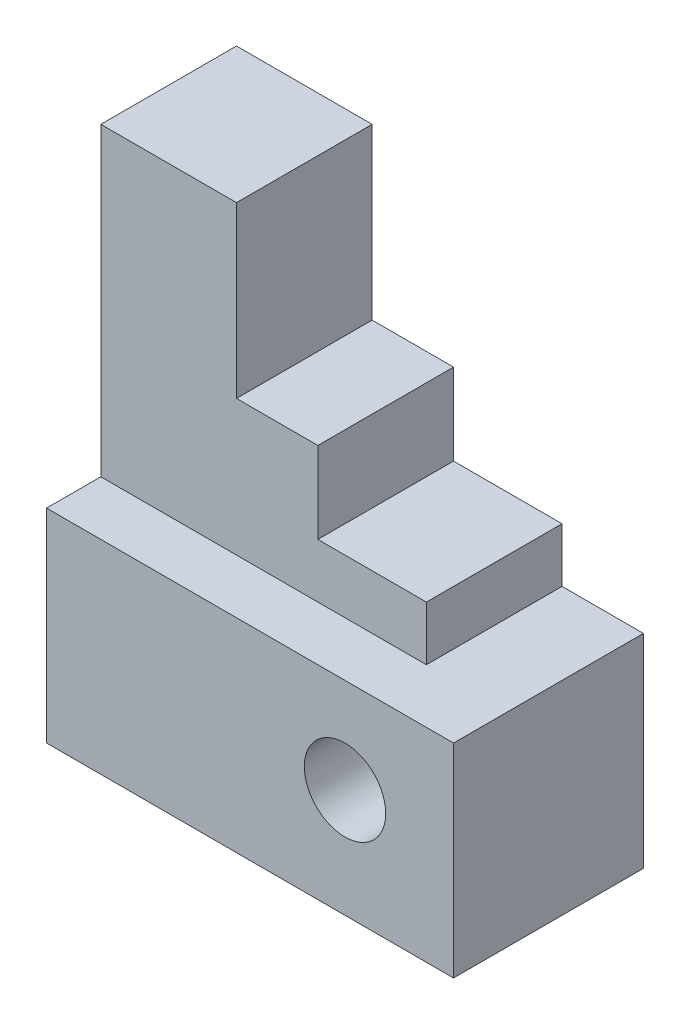
ISO-10303-21;
HEADER;
FILE_DESCRIPTION(('STEP AP214'),'2;1');
FILE_NAME('part.step','',(''),(''),'','','');
FILE_SCHEMA(('AUTOMOTIVE_DESIGN { 1 0 10303 214 1 1 1 1 }'));
ENDSEC;
DATA;
#1=APPLICATION_CONTEXT('core data for automotive mechanical design processes');
#2=APPLICATION_PROTOCOL_DEFINITION('international standard','automotive_design',2000,#1);
#3=PRODUCT_CONTEXT('',#1,'mechanical');
#4=PRODUCT('Part','Part','',(#3));
#5=PRODUCT_RELATED_PRODUCT_CATEGORY('part','',(#4));
#6=PRODUCT_DEFINITION_FORMATION('','',#4);
#7=PRODUCT_DEFINITION_CONTEXT('part definition',#1,'design');
#8=PRODUCT_DEFINITION('design','',#6,#7);
#9=PRODUCT_DEFINITION_SHAPE('','',#8);
#10=(LENGTH_UNIT() NAMED_UNIT(*) SI_UNIT(.MILLI.,.METRE.));
#11=(NAMED_UNIT(*) PLANE_ANGLE_UNIT() SI_UNIT($,.RADIAN.));
#12=(NAMED_UNIT(*) SI_UNIT($,.STERADIAN.) SOLID_ANGLE_UNIT());
#13=UNCERTAINTY_MEASURE_WITH_UNIT(LENGTH_MEASURE(1.E-05),#10,'distance_accuracy_value','');
#14=(GEOMETRIC_REPRESENTATION_CONTEXT(3) GLOBAL_UNCERTAINTY_ASSIGNED_CONTEXT((#13)) GLOBAL_UNIT_ASSIGNED_CONTEXT((#10,
#11,#12)) REPRESENTATION_CONTEXT('',''));
#15=CARTESIAN_POINT('',(0.,0.,0.));
#16=DIRECTION('',(0.,0.,1.));
#17=DIRECTION('',(1.,0.,0.));
#18=AXIS2_PLACEMENT_3D('',#15,#16,#17);
#19=CARTESIAN_POINT('',(0.,30.,28.));
#20=DIRECTION('',(0.,-1.,0.));
#21=DIRECTION('',(0.,0.,-1.));
#22=AXIS2_PLACEMENT_3D('',#19,#20,#21);
#23=PLANE('',#22);
#24=DIRECTION('',(0.,0.,-1.));
#25=VECTOR('',#24,1.);
#26=CARTESIAN_POINT('',(48.,30.,20.));
#27=LINE('',#26,#25);
#28=CARTESIAN_POINT('',(48.,30.,20.));
#29=VERTEX_POINT('',#28);
#30=CARTESIAN_POINT('',(48.,30.,0.));
#31=VERTEX_POINT('',#30);
#32=EDGE_CURVE('E223',#29,#31,#27,.T.);
#33=ORIENTED_EDGE('',*,*,#32,.F.);
#34=DIRECTION('',(-1.,0.,0.));
#35=VECTOR('',#34,1.);
#36=CARTESIAN_POINT('',(0.,30.,20.));
#37=LINE('',#36,#35);
#38=CARTESIAN_POINT('',(0.,30.,20.));
#39=VERTEX_POINT('',#38);
#40=EDGE_CURVE('E415',#29,#39,#37,.T.);
#41=ORIENTED_EDGE('',*,*,#40,.T.);
#42=DIRECTION('',(0.,0.,-1.));
#43=VECTOR('',#42,1.);
#44=CARTESIAN_POINT('',(0.,30.,28.));
#45=LINE('',#44,#43);
#46=CARTESIAN_POINT('',(0.,30.,28.));
#47=VERTEX_POINT('',#46);
#48=EDGE_CURVE('E11',#47,#39,#45,.T.);
#49=ORIENTED_EDGE('',*,*,#48,.F.);
#50=DIRECTION('',(-1.,0.,0.));
#51=VECTOR('',#50,1.);
#52=CARTESIAN_POINT('',(0.,30.,28.));
#53=LINE('',#52,#51);
#54=CARTESIAN_POINT('',(60.,30.,28.));
#55=VERTEX_POINT('',#54);
#56=EDGE_CURVE('E182',#55,#47,#53,.T.);
#57=ORIENTED_EDGE('',*,*,#56,.F.);
#58=DIRECTION('',(0.,0.,-1.));
#59=VECTOR('',#58,1.);
#60=CARTESIAN_POINT('',(60.,30.,28.));
#61=LINE('',#60,#59);
#62=CARTESIAN_POINT('',(60.,30.,0.));
#63=VERTEX_POINT('',#62);
#64=EDGE_CURVE('E191',#55,#63,#61,.T.);
#65=ORIENTED_EDGE('',*,*,#64,.T.);
#66=DIRECTION('',(-1.,0.,0.));
#67=VECTOR('',#66,1.);
#68=CARTESIAN_POINT('',(0.,30.,0.));
#69=LINE('',#68,#67);
#70=EDGE_CURVE('E172',#63,#31,#69,.T.);
#71=ORIENTED_EDGE('',*,*,#70,.T.);
#72=EDGE_LOOP('',(#33,#41,#49,#57,#65,#71));
#73=FACE_BOUND('',#72,.T.);
#74=ADVANCED_FACE('F47',(#73),#23,.F.);
#75=CARTESIAN_POINT('',(0.,0.,28.));
#76=DIRECTION('',(1.,0.,0.));
#77=DIRECTION('',(0.,0.,-1.));
#78=AXIS2_PLACEMENT_3D('',#75,#76,#77);
#79=PLANE('',#78);
#80=DIRECTION('',(0.,-1.,0.));
#81=VECTOR('',#80,1.);
#82=CARTESIAN_POINT('',(0.,0.,0.));
#83=LINE('',#82,#81);
#84=CARTESIAN_POINT('',(0.,75.,0.));
#85=VERTEX_POINT('',#84);
#86=CARTESIAN_POINT('',(0.,0.,0.));
#87=VERTEX_POINT('',#86);
#88=EDGE_CURVE('E196',#85,#87,#83,.T.);
#89=ORIENTED_EDGE('',*,*,#88,.T.);
#90=DIRECTION('',(0.,0.,-1.));
#91=VECTOR('',#90,1.);
#92=CARTESIAN_POINT('',(0.,0.,28.));
#93=LINE('',#92,#91);
#94=CARTESIAN_POINT('',(0.,0.,28.));
#95=VERTEX_POINT('',#94);
#96=EDGE_CURVE('E56',#95,#87,#93,.T.);
#97=ORIENTED_EDGE('',*,*,#96,.F.);
#98=DIRECTION('',(0.,-1.,0.));
#99=VECTOR('',#98,1.);
#100=CARTESIAN_POINT('',(0.,0.,28.));
#101=LINE('',#100,#99);
#102=EDGE_CURVE('E97',#47,#95,#101,.T.);
#103=ORIENTED_EDGE('',*,*,#102,.F.);
#104=ORIENTED_EDGE('',*,*,#48,.T.);
#105=DIRECTION('',(0.,-1.,0.));
#106=VECTOR('',#105,1.);
#107=CARTESIAN_POINT('',(0.,0.,20.));
#108=LINE('',#107,#106);
#109=CARTESIAN_POINT('',(0.,75.,20.));
#110=VERTEX_POINT('',#109);
#111=EDGE_CURVE('E63',#110,#39,#108,.T.);
#112=ORIENTED_EDGE('',*,*,#111,.F.);
#113=DIRECTION('',(0.,0.,-1.));
#114=VECTOR('',#113,1.);
#115=CARTESIAN_POINT('',(0.,75.,20.));
#116=LINE('',#115,#114);
#117=EDGE_CURVE('E398',#110,#85,#116,.T.);
#118=ORIENTED_EDGE('',*,*,#117,.T.);
#119=EDGE_LOOP('',(#89,#97,#103,#104,#112,#118));
#120=FACE_BOUND('',#119,.T.);
#121=ADVANCED_FACE('F240',(#120),#79,.F.);
#122=CARTESIAN_POINT('',(0.,0.,28.));
#123=DIRECTION('',(0.,1.,0.));
#124=DIRECTION('',(0.,0.,1.));
#125=AXIS2_PLACEMENT_3D('',#122,#123,#124);
#126=PLANE('',#125);
#127=DIRECTION('',(1.,0.,0.));
#128=VECTOR('',#127,1.);
#129=CARTESIAN_POINT('',(0.,0.,0.));
#130=LINE('',#129,#128);
#131=CARTESIAN_POINT('',(60.,0.,0.));
#132=VERTEX_POINT('',#131);
#133=EDGE_CURVE('E199',#87,#132,#130,.T.);
#134=ORIENTED_EDGE('',*,*,#133,.T.);
#135=DIRECTION('',(0.,0.,-1.));
#136=VECTOR('',#135,1.);
#137=CARTESIAN_POINT('',(60.,0.,28.));
#138=LINE('',#137,#136);
#139=CARTESIAN_POINT('',(60.,0.,28.));
#140=VERTEX_POINT('',#139);
#141=EDGE_CURVE('E206',#140,#132,#138,.T.);
#142=ORIENTED_EDGE('',*,*,#141,.F.);
#143=DIRECTION('',(1.,0.,0.));
#144=VECTOR('',#143,1.);
#145=CARTESIAN_POINT('',(0.,0.,28.));
#146=LINE('',#145,#144);
#147=EDGE_CURVE('E187',#95,#140,#146,.T.);
#148=ORIENTED_EDGE('',*,*,#147,.F.);
#149=ORIENTED_EDGE('',*,*,#96,.T.);
#150=EDGE_LOOP('',(#134,#142,#148,#149));
#151=FACE_BOUND('',#150,.T.);
#152=ADVANCED_FACE('F213',(#151),#126,.F.);
#153=CARTESIAN_POINT('',(44.,16.,28.));
#154=DIRECTION('',(0.,0.,-1.));
#155=DIRECTION('',(-1.,0.,0.));
#156=AXIS2_PLACEMENT_3D('',#153,#154,#155);
#157=CYLINDRICAL_SURFACE('',#156,6.);
#158=CARTESIAN_POINT('',(44.,16.,28.));
#159=DIRECTION('',(0.,0.,1.));
#160=DIRECTION('',(1.,0.,0.));
#161=AXIS2_PLACEMENT_3D('',#158,#159,#160);
#162=CIRCLE('',#161,6.);
#163=CARTESIAN_POINT('',(50.,16.,28.));
#164=VERTEX_POINT('',#163);
#165=EDGE_CURVE('E178',#164,#164,#162,.T.);
#166=ORIENTED_EDGE('',*,*,#165,.T.);
#167=EDGE_LOOP('',(#166));
#168=FACE_BOUND('',#167,.T.);
#169=CARTESIAN_POINT('',(44.,16.,0.));
#170=DIRECTION('',(0.,0.,1.));
#171=DIRECTION('',(1.,0.,0.));
#172=AXIS2_PLACEMENT_3D('',#169,#170,#171);
#173=CIRCLE('',#172,6.);
#174=CARTESIAN_POINT('',(50.,16.,0.));
#175=VERTEX_POINT('',#174);
#176=EDGE_CURVE('E167',#175,#175,#173,.T.);
#177=ORIENTED_EDGE('',*,*,#176,.F.);
#178=EDGE_LOOP('',(#177));
#179=FACE_BOUND('',#178,.T.);
#180=ADVANCED_FACE('F49',(#168,#179),#157,.F.);
#181=CARTESIAN_POINT('',(60.,0.,28.));
#182=DIRECTION('',(-1.,0.,0.));
#183=DIRECTION('',(0.,0.,1.));
#184=AXIS2_PLACEMENT_3D('',#181,#182,#183);
#185=PLANE('',#184);
#186=DIRECTION('',(0.,1.,0.));
#187=VECTOR('',#186,1.);
#188=CARTESIAN_POINT('',(60.,0.,0.));
#189=LINE('',#188,#187);
#190=EDGE_CURVE('E90',#132,#63,#189,.T.);
#191=ORIENTED_EDGE('',*,*,#190,.T.);
#192=ORIENTED_EDGE('',*,*,#64,.F.);
#193=DIRECTION('',(0.,1.,0.));
#194=VECTOR('',#193,1.);
#195=CARTESIAN_POINT('',(60.,0.,28.));
#196=LINE('',#195,#194);
#197=EDGE_CURVE('E72',#140,#55,#196,.T.);
#198=ORIENTED_EDGE('',*,*,#197,.F.);
#199=ORIENTED_EDGE('',*,*,#141,.T.);
#200=EDGE_LOOP('',(#191,#192,#198,#199));
#201=FACE_BOUND('',#200,.T.);
#202=ADVANCED_FACE('F226',(#201),#185,.F.);
#203=CARTESIAN_POINT('',(0.,0.,28.));
#204=DIRECTION('',(0.,0.,1.));
#205=DIRECTION('',(1.,0.,0.));
#206=AXIS2_PLACEMENT_3D('',#203,#204,#205);
#207=PLANE('',#206);
#208=ORIENTED_EDGE('',*,*,#165,.F.);
#209=EDGE_LOOP('',(#208));
#210=FACE_BOUND('',#209,.T.);
#211=ORIENTED_EDGE('',*,*,#56,.T.);
#212=ORIENTED_EDGE('',*,*,#102,.T.);
#213=ORIENTED_EDGE('',*,*,#147,.T.);
#214=ORIENTED_EDGE('',*,*,#197,.T.);
#215=EDGE_LOOP('',(#211,#212,#213,#214));
#216=FACE_BOUND('',#215,.T.);
#217=ADVANCED_FACE('F228',(#210,#216),#207,.T.);
#218=CARTESIAN_POINT('',(0.,0.,0.));
#219=DIRECTION('',(0.,0.,1.));
#220=DIRECTION('',(1.,0.,0.));
#221=AXIS2_PLACEMENT_3D('',#218,#219,#220);
#222=PLANE('',#221);
#223=ORIENTED_EDGE('',*,*,#176,.T.);
#224=EDGE_LOOP('',(#223));
#225=FACE_BOUND('',#224,.T.);
#226=ORIENTED_EDGE('',*,*,#70,.F.);
#227=ORIENTED_EDGE('',*,*,#190,.F.);
#228=ORIENTED_EDGE('',*,*,#133,.F.);
#229=ORIENTED_EDGE('',*,*,#88,.F.);
#230=DIRECTION('',(-1.,0.,0.));
#231=VECTOR('',#230,1.);
#232=CARTESIAN_POINT('',(0.,75.,0.));
#233=LINE('',#232,#231);
#234=CARTESIAN_POINT('',(20.,75.,0.));
#235=VERTEX_POINT('',#234);
#236=EDGE_CURVE('E375',#235,#85,#233,.T.);
#237=ORIENTED_EDGE('',*,*,#236,.F.);
#238=DIRECTION('',(0.,1.,0.));
#239=VECTOR('',#238,1.);
#240=CARTESIAN_POINT('',(20.,0.,0.));
#241=LINE('',#240,#239);
#242=CARTESIAN_POINT('',(20.,50.,0.));
#243=VERTEX_POINT('',#242);
#244=EDGE_CURVE('E391',#243,#235,#241,.T.);
#245=ORIENTED_EDGE('',*,*,#244,.F.);
#246=DIRECTION('',(-1.,0.,0.));
#247=VECTOR('',#246,1.);
#248=CARTESIAN_POINT('',(0.,50.,0.));
#249=LINE('',#248,#247);
#250=CARTESIAN_POINT('',(32.,50.,0.));
#251=VERTEX_POINT('',#250);
#252=EDGE_CURVE('E384',#251,#243,#249,.T.);
#253=ORIENTED_EDGE('',*,*,#252,.F.);
#254=DIRECTION('',(0.,1.,0.));
#255=VECTOR('',#254,1.);
#256=CARTESIAN_POINT('',(32.,0.,0.));
#257=LINE('',#256,#255);
#258=CARTESIAN_POINT('',(32.,38.,0.));
#259=VERTEX_POINT('',#258);
#260=EDGE_CURVE('E380',#259,#251,#257,.T.);
#261=ORIENTED_EDGE('',*,*,#260,.F.);
#262=DIRECTION('',(-1.,0.,0.));
#263=VECTOR('',#262,1.);
#264=CARTESIAN_POINT('',(0.,38.,0.));
#265=LINE('',#264,#263);
#266=CARTESIAN_POINT('',(48.,38.,0.));
#267=VERTEX_POINT('',#266);
#268=EDGE_CURVE('E165',#267,#259,#265,.T.);
#269=ORIENTED_EDGE('',*,*,#268,.F.);
#270=DIRECTION('',(0.,1.,0.));
#271=VECTOR('',#270,1.);
#272=CARTESIAN_POINT('',(48.,0.,0.));
#273=LINE('',#272,#271);
#274=EDGE_CURVE('E161',#31,#267,#273,.T.);
#275=ORIENTED_EDGE('',*,*,#274,.F.);
#276=EDGE_LOOP('',(#226,#227,#228,#229,#237,#245,#253,#261,#269,#275));
#277=FACE_BOUND('',#276,.T.);
#278=ADVANCED_FACE('F217',(#225,#277),#222,.F.);
#279=CARTESIAN_POINT('',(0.,38.,20.));
#280=DIRECTION('',(0.,-1.,0.));
#281=DIRECTION('',(1.,0.,0.));
#282=AXIS2_PLACEMENT_3D('',#279,#280,#281);
#283=PLANE('',#282);
#284=ORIENTED_EDGE('',*,*,#268,.T.);
#285=DIRECTION('',(0.,0.,-1.));
#286=VECTOR('',#285,1.);
#287=CARTESIAN_POINT('',(32.,38.,20.));
#288=LINE('',#287,#286);
#289=CARTESIAN_POINT('',(32.,38.,20.));
#290=VERTEX_POINT('',#289);
#291=EDGE_CURVE('E145',#290,#259,#288,.T.);
#292=ORIENTED_EDGE('',*,*,#291,.F.);
#293=DIRECTION('',(-1.,0.,0.));
#294=VECTOR('',#293,1.);
#295=CARTESIAN_POINT('',(0.,38.,20.));
#296=LINE('',#295,#294);
#297=CARTESIAN_POINT('',(48.,38.,20.));
#298=VERTEX_POINT('',#297);
#299=EDGE_CURVE('E152',#298,#290,#296,.T.);
#300=ORIENTED_EDGE('',*,*,#299,.F.);
#301=DIRECTION('',(0.,0.,-1.));
#302=VECTOR('',#301,1.);
#303=CARTESIAN_POINT('',(48.,38.,20.));
#304=LINE('',#303,#302);
#305=EDGE_CURVE('E373',#298,#267,#304,.T.);
#306=ORIENTED_EDGE('',*,*,#305,.T.);
#307=EDGE_LOOP('',(#284,#292,#300,#306));
#308=FACE_BOUND('',#307,.T.);
#309=ADVANCED_FACE('F163',(#308),#283,.F.);
#310=CARTESIAN_POINT('',(32.,0.,20.));
#311=DIRECTION('',(-1.,0.,0.));
#312=DIRECTION('',(0.,0.,1.));
#313=AXIS2_PLACEMENT_3D('',#310,#311,#312);
#314=PLANE('',#313);
#315=ORIENTED_EDGE('',*,*,#260,.T.);
#316=DIRECTION('',(0.,0.,-1.));
#317=VECTOR('',#316,1.);
#318=CARTESIAN_POINT('',(32.,50.,20.));
#319=LINE('',#318,#317);
#320=CARTESIAN_POINT('',(32.,50.,20.));
#321=VERTEX_POINT('',#320);
#322=EDGE_CURVE('E148',#321,#251,#319,.T.);
#323=ORIENTED_EDGE('',*,*,#322,.F.);
#324=DIRECTION('',(0.,1.,0.));
#325=VECTOR('',#324,1.);
#326=CARTESIAN_POINT('',(32.,0.,20.));
#327=LINE('',#326,#325);
#328=EDGE_CURVE('E141',#290,#321,#327,.T.);
#329=ORIENTED_EDGE('',*,*,#328,.F.);
#330=ORIENTED_EDGE('',*,*,#291,.T.);
#331=EDGE_LOOP('',(#315,#323,#329,#330));
#332=FACE_BOUND('',#331,.T.);
#333=ADVANCED_FACE('F143',(#332),#314,.F.);
#334=CARTESIAN_POINT('',(0.,50.,20.));
#335=DIRECTION('',(0.,-1.,0.));
#336=DIRECTION('',(0.,0.,-1.));
#337=AXIS2_PLACEMENT_3D('',#334,#335,#336);
#338=PLANE('',#337);
#339=ORIENTED_EDGE('',*,*,#252,.T.);
#340=DIRECTION('',(0.,0.,-1.));
#341=VECTOR('',#340,1.);
#342=CARTESIAN_POINT('',(20.,50.,20.));
#343=LINE('',#342,#341);
#344=CARTESIAN_POINT('',(20.,50.,20.));
#345=VERTEX_POINT('',#344);
#346=EDGE_CURVE('E174',#345,#243,#343,.T.);
#347=ORIENTED_EDGE('',*,*,#346,.F.);
#348=DIRECTION('',(-1.,0.,0.));
#349=VECTOR('',#348,1.);
#350=CARTESIAN_POINT('',(0.,50.,20.));
#351=LINE('',#350,#349);
#352=EDGE_CURVE('E151',#321,#345,#351,.T.);
#353=ORIENTED_EDGE('',*,*,#352,.F.);
#354=ORIENTED_EDGE('',*,*,#322,.T.);
#355=EDGE_LOOP('',(#339,#347,#353,#354));
#356=FACE_BOUND('',#355,.T.);
#357=ADVANCED_FACE('F309',(#356),#338,.F.);
#358=CARTESIAN_POINT('',(20.,0.,20.));
#359=DIRECTION('',(-1.,0.,0.));
#360=DIRECTION('',(0.,0.,1.));
#361=AXIS2_PLACEMENT_3D('',#358,#359,#360);
#362=PLANE('',#361);
#363=ORIENTED_EDGE('',*,*,#244,.T.);
#364=DIRECTION('',(0.,0.,-1.));
#365=VECTOR('',#364,1.);
#366=CARTESIAN_POINT('',(20.,75.,20.));
#367=LINE('',#366,#365);
#368=CARTESIAN_POINT('',(20.,75.,20.));
#369=VERTEX_POINT('',#368);
#370=EDGE_CURVE('E402',#369,#235,#367,.T.);
#371=ORIENTED_EDGE('',*,*,#370,.F.);
#372=DIRECTION('',(0.,1.,0.));
#373=VECTOR('',#372,1.);
#374=CARTESIAN_POINT('',(20.,0.,20.));
#375=LINE('',#374,#373);
#376=EDGE_CURVE('E411',#345,#369,#375,.T.);
#377=ORIENTED_EDGE('',*,*,#376,.F.);
#378=ORIENTED_EDGE('',*,*,#346,.T.);
#379=EDGE_LOOP('',(#363,#371,#377,#378));
#380=FACE_BOUND('',#379,.T.);
#381=ADVANCED_FACE('F318',(#380),#362,.F.);
#382=CARTESIAN_POINT('',(0.,75.,20.));
#383=DIRECTION('',(0.,-1.,0.));
#384=DIRECTION('',(0.,0.,-1.));
#385=AXIS2_PLACEMENT_3D('',#382,#383,#384);
#386=PLANE('',#385);
#387=ORIENTED_EDGE('',*,*,#236,.T.);
#388=ORIENTED_EDGE('',*,*,#117,.F.);
#389=DIRECTION('',(-1.,0.,0.));
#390=VECTOR('',#389,1.);
#391=CARTESIAN_POINT('',(0.,75.,20.));
#392=LINE('',#391,#390);
#393=EDGE_CURVE('E416',#369,#110,#392,.T.);
#394=ORIENTED_EDGE('',*,*,#393,.F.);
#395=ORIENTED_EDGE('',*,*,#370,.T.);
#396=EDGE_LOOP('',(#387,#388,#394,#395));
#397=FACE_BOUND('',#396,.T.);
#398=ADVANCED_FACE('F326',(#397),#386,.F.);
#399=CARTESIAN_POINT('',(48.,0.,20.));
#400=DIRECTION('',(-1.,0.,0.));
#401=DIRECTION('',(0.,0.,1.));
#402=AXIS2_PLACEMENT_3D('',#399,#400,#401);
#403=PLANE('',#402);
#404=ORIENTED_EDGE('',*,*,#274,.T.);
#405=ORIENTED_EDGE('',*,*,#305,.F.);
#406=DIRECTION('',(0.,1.,0.));
#407=VECTOR('',#406,1.);
#408=CARTESIAN_POINT('',(48.,0.,20.));
#409=LINE('',#408,#407);
#410=EDGE_CURVE('E156',#29,#298,#409,.T.);
#411=ORIENTED_EDGE('',*,*,#410,.F.);
#412=ORIENTED_EDGE('',*,*,#32,.T.);
#413=EDGE_LOOP('',(#404,#405,#411,#412));
#414=FACE_BOUND('',#413,.T.);
#415=ADVANCED_FACE('F335',(#414),#403,.F.);
#416=CARTESIAN_POINT('',(0.,0.,20.));
#417=DIRECTION('',(0.,0.,1.));
#418=DIRECTION('',(1.,0.,0.));
#419=AXIS2_PLACEMENT_3D('',#416,#417,#418);
#420=PLANE('',#419);
#421=ORIENTED_EDGE('',*,*,#299,.T.);
#422=ORIENTED_EDGE('',*,*,#328,.T.);
#423=ORIENTED_EDGE('',*,*,#352,.T.);
#424=ORIENTED_EDGE('',*,*,#376,.T.);
#425=ORIENTED_EDGE('',*,*,#393,.T.);
#426=ORIENTED_EDGE('',*,*,#111,.T.);
#427=ORIENTED_EDGE('',*,*,#40,.F.);
#428=ORIENTED_EDGE('',*,*,#410,.T.);
#429=EDGE_LOOP('',(#421,#422,#423,#424,#425,#426,#427,#428));
#430=FACE_BOUND('',#429,.T.);
#431=ADVANCED_FACE('F155',(#430),#420,.T.);
#432=CLOSED_SHELL('',(#74,#121,#152,#180,#202,#217,#278,#309,#333,#357,#381,#398,#415,#431));
#433=MANIFOLD_SOLID_BREP('B2',#432);
#434=ADVANCED_BREP_SHAPE_REPRESENTATION('',(#18,#433),#14);
#435=SHAPE_DEFINITION_REPRESENTATION(#9,#434);
ENDSEC;
END-ISO-10303-21;
